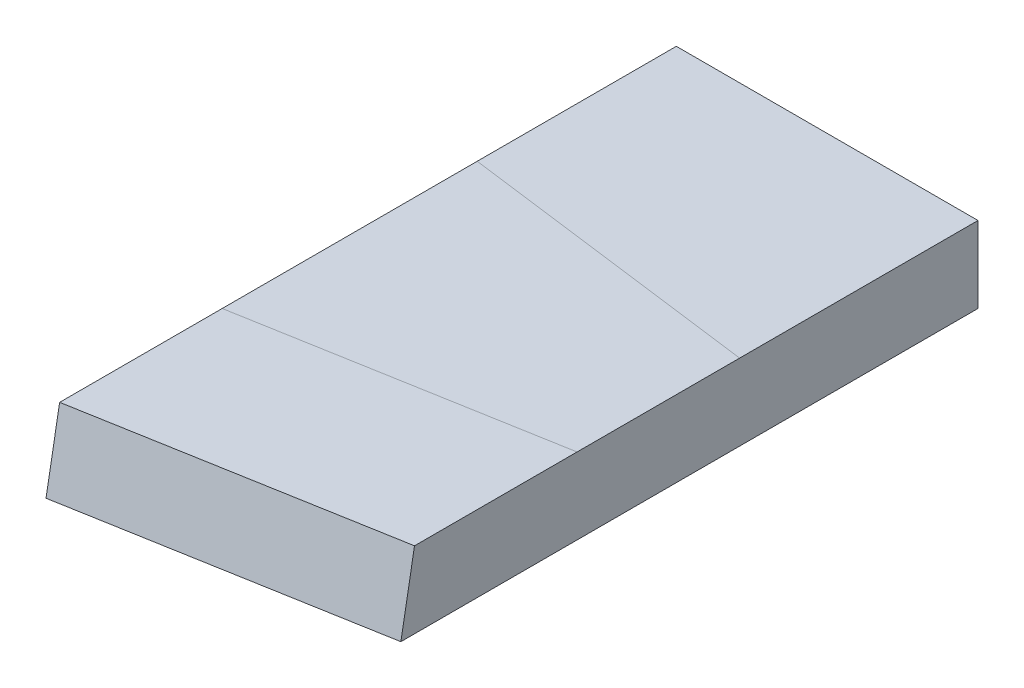
ISO-10303-21;
HEADER;
FILE_DESCRIPTION(('STEP AP214'),'2;1');
FILE_NAME('part.step','',(''),(''),'','','');
FILE_SCHEMA(('AUTOMOTIVE_DESIGN { 1 0 10303 214 1 1 1 1 }'));
ENDSEC;
DATA;
#1=APPLICATION_CONTEXT('core data for automotive mechanical design processes');
#2=APPLICATION_PROTOCOL_DEFINITION('international standard','automotive_design',2000,#1);
#3=PRODUCT_CONTEXT('',#1,'mechanical');
#4=PRODUCT('Part','Part','',(#3));
#5=PRODUCT_RELATED_PRODUCT_CATEGORY('part','',(#4));
#6=PRODUCT_DEFINITION_FORMATION('','',#4);
#7=PRODUCT_DEFINITION_CONTEXT('part definition',#1,'design');
#8=PRODUCT_DEFINITION('design','',#6,#7);
#9=PRODUCT_DEFINITION_SHAPE('','',#8);
#10=(LENGTH_UNIT() NAMED_UNIT(*) SI_UNIT(.MILLI.,.METRE.));
#11=(NAMED_UNIT(*) PLANE_ANGLE_UNIT() SI_UNIT($,.RADIAN.));
#12=(NAMED_UNIT(*) SI_UNIT($,.STERADIAN.) SOLID_ANGLE_UNIT());
#13=UNCERTAINTY_MEASURE_WITH_UNIT(LENGTH_MEASURE(1.E-05),#10,'distance_accuracy_value','');
#14=(GEOMETRIC_REPRESENTATION_CONTEXT(3) GLOBAL_UNCERTAINTY_ASSIGNED_CONTEXT((#13)) GLOBAL_UNIT_ASSIGNED_CONTEXT((#10,
#11,#12)) REPRESENTATION_CONTEXT('',''));
#15=CARTESIAN_POINT('',(0.,0.,0.));
#16=DIRECTION('',(0.,0.,1.));
#17=DIRECTION('',(1.,0.,0.));
#18=AXIS2_PLACEMENT_3D('',#15,#16,#17);
#19=CARTESIAN_POINT('',(-53.7694244604317,35.1762589928058,260.));
#20=DIRECTION('',(0.,-1.,0.));
#21=DIRECTION('',(0.,0.,-1.));
#22=AXIS2_PLACEMENT_3D('',#19,#20,#21);
#23=PLANE('',#22);
#24=DIRECTION('',(-0.984807753012208,0.,0.17364817766693));
#25=VECTOR('',#24,1.);
#26=CARTESIAN_POINT('',(-62.3971031012714,35.1762589928058,211.070002978702));
#27=LINE('',#26,#25);
#28=CARTESIAN_POINT('',(85.4280575539568,35.1762589928058,185.004438727622));
#29=VERTEX_POINT('',#28);
#30=CARTESIAN_POINT('',(-53.7694244604317,35.1762589928058,209.54871045344));
#31=VERTEX_POINT('',#30);
#32=EDGE_CURVE('E11',#29,#31,#27,.T.);
#33=ORIENTED_EDGE('',*,*,#32,.F.);
#34=DIRECTION('',(0.,0.,-1.));
#35=VECTOR('',#34,1.);
#36=CARTESIAN_POINT('',(85.4280575539568,35.1762589928058,260.));
#37=LINE('',#36,#35);
#38=CARTESIAN_POINT('',(85.4280575539568,35.1762589928058,110.008877455243));
#39=VERTEX_POINT('',#38);
#40=EDGE_CURVE('E129',#29,#39,#37,.T.);
#41=ORIENTED_EDGE('',*,*,#40,.T.);
#42=DIRECTION('',(0.991637585610251,0.,0.129053860093653));
#43=VECTOR('',#42,1.);
#44=CARTESIAN_POINT('',(-32.2560418373189,35.1762589928058,94.6932142346495));
#45=LINE('',#44,#43);
#46=CARTESIAN_POINT('',(-53.7694244604317,35.1762589928058,91.8934160911818));
#47=VERTEX_POINT('',#46);
#48=EDGE_CURVE('E49',#47,#39,#45,.T.);
#49=ORIENTED_EDGE('',*,*,#48,.F.);
#50=DIRECTION('',(0.,0.,-1.));
#51=VECTOR('',#50,1.);
#52=CARTESIAN_POINT('',(-53.7694244604317,35.1762589928058,260.));
#53=LINE('',#52,#51);
#54=EDGE_CURVE('E126',#31,#47,#53,.T.);
#55=ORIENTED_EDGE('',*,*,#54,.F.);
#56=EDGE_LOOP('',(#33,#41,#49,#55));
#57=FACE_BOUND('',#56,.T.);
#58=ADVANCED_FACE('F40',(#57),#23,.F.);
#59=CARTESIAN_POINT('',(85.4280575539568,35.1762589928058,260.));
#60=VERTEX_POINT('',#59);
#61=EDGE_CURVE('E127',#60,#29,#37,.T.);
#62=ORIENTED_EDGE('',*,*,#61,.T.);
#63=ORIENTED_EDGE('',*,*,#32,.T.);
#64=CARTESIAN_POINT('',(-53.7694244604317,35.1762589928058,284.544271725818));
#65=VERTEX_POINT('',#64);
#66=EDGE_CURVE('E122',#65,#31,#53,.T.);
#67=ORIENTED_EDGE('',*,*,#66,.F.);
#68=DIRECTION('',(0.984807753012208,0.,-0.173648177666931));
#69=VECTOR('',#68,1.);
#70=CARTESIAN_POINT('',(85.4280575539568,35.1762589928058,260.));
#71=LINE('',#70,#69);
#72=EDGE_CURVE('E134',#60,#65,#71,.F.);
#73=ORIENTED_EDGE('',*,*,#72,.F.);
#74=EDGE_LOOP('',(#62,#63,#67,#73));
#75=FACE_BOUND('',#74,.T.);
#76=ADVANCED_FACE('F145',(#75),#23,.F.);
#77=CARTESIAN_POINT('',(-53.7694244604317,0.,260.));
#78=DIRECTION('',(1.,0.,0.));
#79=DIRECTION('',(0.,0.,-1.));
#80=AXIS2_PLACEMENT_3D('',#77,#78,#79);
#81=PLANE('',#80);
#82=DIRECTION('',(0.,-1.,0.));
#83=VECTOR('',#82,1.);
#84=CARTESIAN_POINT('',(-53.7694244604317,0.,0.));
#85=LINE('',#84,#83);
#86=CARTESIAN_POINT('',(-53.7694244604317,35.1762589928058,0.));
#87=VERTEX_POINT('',#86);
#88=CARTESIAN_POINT('',(-53.7694244604317,0.,0.));
#89=VERTEX_POINT('',#88);
#90=EDGE_CURVE('E96',#87,#89,#85,.T.);
#91=ORIENTED_EDGE('',*,*,#90,.T.);
#92=DIRECTION('',(0.,0.,-1.));
#93=VECTOR('',#92,1.);
#94=CARTESIAN_POINT('',(-53.7694244604317,0.,260.));
#95=LINE('',#94,#93);
#96=CARTESIAN_POINT('',(-53.7694244604317,0.,290.842479190015));
#97=VERTEX_POINT('',#96);
#98=EDGE_CURVE('E104',#97,#89,#95,.T.);
#99=ORIENTED_EDGE('',*,*,#98,.F.);
#100=DIRECTION('',(0.,0.984346441568213,-0.176244384228252));
#101=VECTOR('',#100,1.);
#102=CARTESIAN_POINT('',(-53.7694244604317,35.3046556963175,284.5212826673));
#103=LINE('',#102,#101);
#104=EDGE_CURVE('E121',#65,#97,#103,.F.);
#105=ORIENTED_EDGE('',*,*,#104,.F.);
#106=ORIENTED_EDGE('',*,*,#66,.T.);
#107=ORIENTED_EDGE('',*,*,#54,.T.);
#108=EDGE_CURVE('E114',#47,#87,#53,.T.);
#109=ORIENTED_EDGE('',*,*,#108,.T.);
#110=EDGE_LOOP('',(#91,#99,#105,#106,#107,#109));
#111=FACE_BOUND('',#110,.T.);
#112=ADVANCED_FACE('F112',(#111),#81,.F.);
#113=CARTESIAN_POINT('',(-53.7694244604317,0.,260.));
#114=DIRECTION('',(0.,1.,0.));
#115=DIRECTION('',(0.,0.,1.));
#116=AXIS2_PLACEMENT_3D('',#113,#114,#115);
#117=PLANE('',#116);
#118=DIRECTION('',(1.,0.,0.));
#119=VECTOR('',#118,1.);
#120=CARTESIAN_POINT('',(-53.7694244604317,0.,0.));
#121=LINE('',#120,#119);
#122=CARTESIAN_POINT('',(85.4280575539568,0.,0.));
#123=VERTEX_POINT('',#122);
#124=EDGE_CURVE('E91',#89,#123,#121,.T.);
#125=ORIENTED_EDGE('',*,*,#124,.T.);
#126=DIRECTION('',(0.,0.,-1.));
#127=VECTOR('',#126,1.);
#128=CARTESIAN_POINT('',(85.4280575539568,0.,260.));
#129=LINE('',#128,#127);
#130=CARTESIAN_POINT('',(85.4280575539568,0.,266.298207464197));
#131=VERTEX_POINT('',#130);
#132=EDGE_CURVE('E110',#131,#123,#129,.T.);
#133=ORIENTED_EDGE('',*,*,#132,.F.);
#134=DIRECTION('',(-0.984807753012208,0.,0.173648177666931));
#135=VECTOR('',#134,1.);
#136=CARTESIAN_POINT('',(-48.4950498838877,0.,289.912464645807));
#137=LINE('',#136,#135);
#138=EDGE_CURVE('E106',#97,#131,#137,.F.);
#139=ORIENTED_EDGE('',*,*,#138,.F.);
#140=ORIENTED_EDGE('',*,*,#98,.T.);
#141=EDGE_LOOP('',(#125,#133,#139,#140));
#142=FACE_BOUND('',#141,.T.);
#143=ADVANCED_FACE('F105',(#142),#117,.F.);
#144=CARTESIAN_POINT('',(85.4280575539568,0.,260.));
#145=DIRECTION('',(-1.,0.,0.));
#146=DIRECTION('',(0.,0.,1.));
#147=AXIS2_PLACEMENT_3D('',#144,#145,#146);
#148=PLANE('',#147);
#149=DIRECTION('',(0.,1.,0.));
#150=VECTOR('',#149,1.);
#151=CARTESIAN_POINT('',(85.4280575539568,0.,0.));
#152=LINE('',#151,#150);
#153=CARTESIAN_POINT('',(85.4280575539568,35.1762589928058,0.));
#154=VERTEX_POINT('',#153);
#155=EDGE_CURVE('E98',#123,#154,#152,.T.);
#156=ORIENTED_EDGE('',*,*,#155,.T.);
#157=EDGE_CURVE('E125',#39,#154,#37,.T.);
#158=ORIENTED_EDGE('',*,*,#157,.F.);
#159=ORIENTED_EDGE('',*,*,#40,.F.);
#160=ORIENTED_EDGE('',*,*,#61,.F.);
#161=DIRECTION('',(0.,-0.984346441568213,0.176244384228252));
#162=VECTOR('',#161,1.);
#163=CARTESIAN_POINT('',(85.4280575539568,31.0465796470852,260.739407146316));
#164=LINE('',#163,#162);
#165=EDGE_CURVE('E136',#131,#60,#164,.F.);
#166=ORIENTED_EDGE('',*,*,#165,.F.);
#167=ORIENTED_EDGE('',*,*,#132,.T.);
#168=EDGE_LOOP('',(#156,#158,#159,#160,#166,#167));
#169=FACE_BOUND('',#168,.T.);
#170=ADVANCED_FACE('F142',(#169),#148,.F.);
#171=ORIENTED_EDGE('',*,*,#108,.F.);
#172=ORIENTED_EDGE('',*,*,#48,.T.);
#173=ORIENTED_EDGE('',*,*,#157,.T.);
#174=DIRECTION('',(-1.,0.,0.));
#175=VECTOR('',#174,1.);
#176=CARTESIAN_POINT('',(-53.7694244604317,35.1762589928058,0.));
#177=LINE('',#176,#175);
#178=EDGE_CURVE('E119',#154,#87,#177,.T.);
#179=ORIENTED_EDGE('',*,*,#178,.T.);
#180=EDGE_LOOP('',(#171,#172,#173,#179));
#181=FACE_BOUND('',#180,.T.);
#182=ADVANCED_FACE('F148',(#181),#23,.F.);
#183=CARTESIAN_POINT('',(-49.5721067936874,35.1762589928058,283.804171374567));
#184=DIRECTION('',(0.171010071662835,0.173648177666931,0.969846310392954));
#185=DIRECTION('',(0.,-0.984346441568213,0.176244384228252));
#186=AXIS2_PLACEMENT_3D('',#183,#184,#185);
#187=PLANE('',#186);
#188=ORIENTED_EDGE('',*,*,#104,.T.);
#189=ORIENTED_EDGE('',*,*,#138,.T.);
#190=ORIENTED_EDGE('',*,*,#165,.T.);
#191=ORIENTED_EDGE('',*,*,#72,.T.);
#192=EDGE_LOOP('',(#188,#189,#190,#191));
#193=FACE_BOUND('',#192,.T.);
#194=ADVANCED_FACE('F42',(#193),#187,.T.);
#195=CARTESIAN_POINT('',(-53.7694244604317,35.1762589928058,0.));
#196=DIRECTION('',(0.,0.,-1.));
#197=DIRECTION('',(-1.,0.,0.));
#198=AXIS2_PLACEMENT_3D('',#195,#196,#197);
#199=PLANE('',#198);
#200=ORIENTED_EDGE('',*,*,#90,.F.);
#201=ORIENTED_EDGE('',*,*,#178,.F.);
#202=ORIENTED_EDGE('',*,*,#155,.F.);
#203=ORIENTED_EDGE('',*,*,#124,.F.);
#204=EDGE_LOOP('',(#200,#201,#202,#203));
#205=FACE_BOUND('',#204,.T.);
#206=ADVANCED_FACE('F93',(#205),#199,.T.);
#207=CLOSED_SHELL('',(#58,#76,#112,#143,#170,#182,#194,#206));
#208=MANIFOLD_SOLID_BREP('B2',#207);
#209=ADVANCED_BREP_SHAPE_REPRESENTATION('',(#18,#208),#14);
#210=SHAPE_DEFINITION_REPRESENTATION(#9,#209);
ENDSEC;
END-ISO-10303-21;
